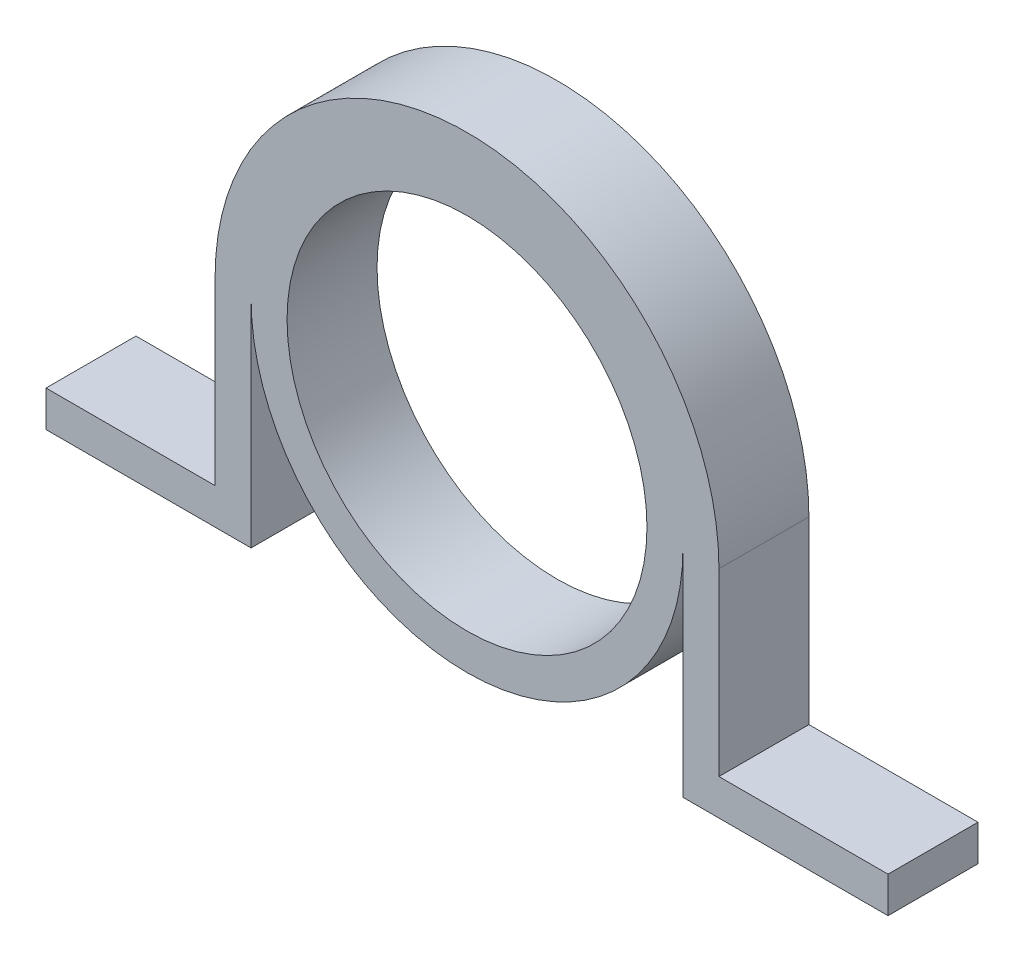
ISO-10303-21;
HEADER;
FILE_DESCRIPTION(('STEP AP214'),'2;1');
FILE_NAME('part.step','',(''),(''),'','','');
FILE_SCHEMA(('AUTOMOTIVE_DESIGN { 1 0 10303 214 1 1 1 1 }'));
ENDSEC;
DATA;
#1=APPLICATION_CONTEXT('core data for automotive mechanical design processes');
#2=APPLICATION_PROTOCOL_DEFINITION('international standard','automotive_design',2000,#1);
#3=PRODUCT_CONTEXT('',#1,'mechanical');
#4=PRODUCT('Part','Part','',(#3));
#5=PRODUCT_RELATED_PRODUCT_CATEGORY('part','',(#4));
#6=PRODUCT_DEFINITION_FORMATION('','',#4);
#7=PRODUCT_DEFINITION_CONTEXT('part definition',#1,'design');
#8=PRODUCT_DEFINITION('design','',#6,#7);
#9=PRODUCT_DEFINITION_SHAPE('','',#8);
#10=(LENGTH_UNIT() NAMED_UNIT(*) SI_UNIT(.MILLI.,.METRE.));
#11=(NAMED_UNIT(*) PLANE_ANGLE_UNIT() SI_UNIT($,.RADIAN.));
#12=(NAMED_UNIT(*) SI_UNIT($,.STERADIAN.) SOLID_ANGLE_UNIT());
#13=UNCERTAINTY_MEASURE_WITH_UNIT(LENGTH_MEASURE(1.E-05),#10,'distance_accuracy_value','');
#14=(GEOMETRIC_REPRESENTATION_CONTEXT(3) GLOBAL_UNCERTAINTY_ASSIGNED_CONTEXT((#13)) GLOBAL_UNIT_ASSIGNED_CONTEXT((#10,
#11,#12)) REPRESENTATION_CONTEXT('',''));
#15=CARTESIAN_POINT('',(0.,0.,0.));
#16=DIRECTION('',(0.,0.,1.));
#17=DIRECTION('',(1.,0.,0.));
#18=AXIS2_PLACEMENT_3D('',#15,#16,#17);
#19=CARTESIAN_POINT('',(14.,0.,5.));
#20=DIRECTION('',(-1.,0.,0.));
#21=DIRECTION('',(0.,0.,1.));
#22=AXIS2_PLACEMENT_3D('',#19,#20,#21);
#23=PLANE('',#22);
#24=DIRECTION('',(0.,1.,0.));
#25=VECTOR('',#24,1.);
#26=CARTESIAN_POINT('',(14.,0.,0.));
#27=LINE('',#26,#25);
#28=CARTESIAN_POINT('',(14.,-10.,0.));
#29=VERTEX_POINT('',#28);
#30=CARTESIAN_POINT('',(14.,0.,0.));
#31=VERTEX_POINT('',#30);
#32=EDGE_CURVE('E171',#29,#31,#27,.T.);
#33=ORIENTED_EDGE('',*,*,#32,.T.);
#34=DIRECTION('',(0.,0.,-1.));
#35=VECTOR('',#34,1.);
#36=CARTESIAN_POINT('',(14.,0.,5.));
#37=LINE('',#36,#35);
#38=CARTESIAN_POINT('',(14.,0.,5.));
#39=VERTEX_POINT('',#38);
#40=EDGE_CURVE('E11',#39,#31,#37,.T.);
#41=ORIENTED_EDGE('',*,*,#40,.F.);
#42=DIRECTION('',(0.,1.,0.));
#43=VECTOR('',#42,1.);
#44=CARTESIAN_POINT('',(14.,0.,5.));
#45=LINE('',#44,#43);
#46=CARTESIAN_POINT('',(14.,-10.,5.));
#47=VERTEX_POINT('',#46);
#48=EDGE_CURVE('E215',#47,#39,#45,.T.);
#49=ORIENTED_EDGE('',*,*,#48,.F.);
#50=DIRECTION('',(0.,0.,-1.));
#51=VECTOR('',#50,1.);
#52=CARTESIAN_POINT('',(14.,-10.,5.));
#53=LINE('',#52,#51);
#54=EDGE_CURVE('E170',#47,#29,#53,.T.);
#55=ORIENTED_EDGE('',*,*,#54,.T.);
#56=EDGE_LOOP('',(#33,#41,#49,#55));
#57=FACE_BOUND('',#56,.T.);
#58=ADVANCED_FACE('F41',(#57),#23,.F.);
#59=CARTESIAN_POINT('',(0.,0.,5.));
#60=DIRECTION('',(0.,0.,-1.));
#61=DIRECTION('',(-1.,0.,0.));
#62=AXIS2_PLACEMENT_3D('',#59,#60,#61);
#63=CYLINDRICAL_SURFACE('',#62,14.);
#64=CARTESIAN_POINT('',(0.,0.,0.));
#65=DIRECTION('',(0.,0.,1.));
#66=DIRECTION('',(1.,0.,0.));
#67=AXIS2_PLACEMENT_3D('',#64,#65,#66);
#68=CIRCLE('',#67,14.);
#69=CARTESIAN_POINT('',(-14.,0.,0.));
#70=VERTEX_POINT('',#69);
#71=EDGE_CURVE('E175',#31,#70,#68,.T.);
#72=ORIENTED_EDGE('',*,*,#71,.T.);
#73=DIRECTION('',(0.,0.,-1.));
#74=VECTOR('',#73,1.);
#75=CARTESIAN_POINT('',(-14.,0.,5.));
#76=LINE('',#75,#74);
#77=CARTESIAN_POINT('',(-14.,0.,5.));
#78=VERTEX_POINT('',#77);
#79=EDGE_CURVE('E50',#78,#70,#76,.T.);
#80=ORIENTED_EDGE('',*,*,#79,.F.);
#81=CARTESIAN_POINT('',(0.,0.,5.));
#82=DIRECTION('',(0.,0.,1.));
#83=DIRECTION('',(1.,0.,0.));
#84=AXIS2_PLACEMENT_3D('',#81,#82,#83);
#85=CIRCLE('',#84,14.);
#86=EDGE_CURVE('E113',#39,#78,#85,.T.);
#87=ORIENTED_EDGE('',*,*,#86,.F.);
#88=ORIENTED_EDGE('',*,*,#40,.T.);
#89=EDGE_LOOP('',(#72,#80,#87,#88));
#90=FACE_BOUND('',#89,.T.);
#91=ADVANCED_FACE('F247',(#90),#63,.T.);
#92=CARTESIAN_POINT('',(-14.,0.,5.));
#93=DIRECTION('',(-1.,0.,0.));
#94=DIRECTION('',(0.,0.,1.));
#95=AXIS2_PLACEMENT_3D('',#92,#93,#94);
#96=PLANE('',#95);
#97=DIRECTION('',(0.,1.,0.));
#98=VECTOR('',#97,1.);
#99=CARTESIAN_POINT('',(-14.,0.,0.));
#100=LINE('',#99,#98);
#101=CARTESIAN_POINT('',(-14.,-10.,0.));
#102=VERTEX_POINT('',#101);
#103=EDGE_CURVE('E179',#102,#70,#100,.T.);
#104=ORIENTED_EDGE('',*,*,#103,.F.);
#105=DIRECTION('',(0.,0.,-1.));
#106=VECTOR('',#105,1.);
#107=CARTESIAN_POINT('',(-14.,-10.,5.));
#108=LINE('',#107,#106);
#109=CARTESIAN_POINT('',(-14.,-10.,5.));
#110=VERTEX_POINT('',#109);
#111=EDGE_CURVE('E238',#110,#102,#108,.T.);
#112=ORIENTED_EDGE('',*,*,#111,.F.);
#113=DIRECTION('',(0.,1.,0.));
#114=VECTOR('',#113,1.);
#115=CARTESIAN_POINT('',(-14.,0.,5.));
#116=LINE('',#115,#114);
#117=EDGE_CURVE('E246',#110,#78,#116,.T.);
#118=ORIENTED_EDGE('',*,*,#117,.T.);
#119=ORIENTED_EDGE('',*,*,#79,.T.);
#120=EDGE_LOOP('',(#104,#112,#118,#119));
#121=FACE_BOUND('',#120,.T.);
#122=ADVANCED_FACE('F244',(#121),#96,.T.);
#123=CARTESIAN_POINT('',(0.,-10.,5.));
#124=DIRECTION('',(0.,1.,0.));
#125=DIRECTION('',(0.,0.,1.));
#126=AXIS2_PLACEMENT_3D('',#123,#124,#125);
#127=PLANE('',#126);
#128=DIRECTION('',(1.,0.,0.));
#129=VECTOR('',#128,1.);
#130=CARTESIAN_POINT('',(0.,-10.,0.));
#131=LINE('',#130,#129);
#132=CARTESIAN_POINT('',(-23.3952710011422,-10.,0.));
#133=VERTEX_POINT('',#132);
#134=EDGE_CURVE('E183',#133,#102,#131,.T.);
#135=ORIENTED_EDGE('',*,*,#134,.F.);
#136=DIRECTION('',(0.,0.,-1.));
#137=VECTOR('',#136,1.);
#138=CARTESIAN_POINT('',(-23.3952710011422,-10.,5.));
#139=LINE('',#138,#137);
#140=CARTESIAN_POINT('',(-23.3952710011422,-10.,5.));
#141=VERTEX_POINT('',#140);
#142=EDGE_CURVE('E235',#141,#133,#139,.T.);
#143=ORIENTED_EDGE('',*,*,#142,.F.);
#144=DIRECTION('',(1.,0.,0.));
#145=VECTOR('',#144,1.);
#146=CARTESIAN_POINT('',(0.,-10.,5.));
#147=LINE('',#146,#145);
#148=EDGE_CURVE('E259',#141,#110,#147,.T.);
#149=ORIENTED_EDGE('',*,*,#148,.T.);
#150=ORIENTED_EDGE('',*,*,#111,.T.);
#151=EDGE_LOOP('',(#135,#143,#149,#150));
#152=FACE_BOUND('',#151,.T.);
#153=ADVANCED_FACE('F256',(#152),#127,.T.);
#154=CARTESIAN_POINT('',(-23.3952710011422,0.,5.));
#155=DIRECTION('',(-1.,0.,0.));
#156=DIRECTION('',(0.,0.,1.));
#157=AXIS2_PLACEMENT_3D('',#154,#155,#156);
#158=PLANE('',#157);
#159=DIRECTION('',(0.,1.,0.));
#160=VECTOR('',#159,1.);
#161=CARTESIAN_POINT('',(-23.3952710011422,0.,0.));
#162=LINE('',#161,#160);
#163=CARTESIAN_POINT('',(-23.3952710011422,-12.,0.));
#164=VERTEX_POINT('',#163);
#165=EDGE_CURVE('E187',#164,#133,#162,.T.);
#166=ORIENTED_EDGE('',*,*,#165,.F.);
#167=DIRECTION('',(0.,0.,-1.));
#168=VECTOR('',#167,1.);
#169=CARTESIAN_POINT('',(-23.3952710011422,-12.,5.));
#170=LINE('',#169,#168);
#171=CARTESIAN_POINT('',(-23.3952710011422,-12.,5.));
#172=VERTEX_POINT('',#171);
#173=EDGE_CURVE('E232',#172,#164,#170,.T.);
#174=ORIENTED_EDGE('',*,*,#173,.F.);
#175=DIRECTION('',(0.,1.,0.));
#176=VECTOR('',#175,1.);
#177=CARTESIAN_POINT('',(-23.3952710011422,0.,5.));
#178=LINE('',#177,#176);
#179=EDGE_CURVE('E266',#172,#141,#178,.T.);
#180=ORIENTED_EDGE('',*,*,#179,.T.);
#181=ORIENTED_EDGE('',*,*,#142,.T.);
#182=EDGE_LOOP('',(#166,#174,#180,#181));
#183=FACE_BOUND('',#182,.T.);
#184=ADVANCED_FACE('F318',(#183),#158,.T.);
#185=CARTESIAN_POINT('',(0.,-12.,5.));
#186=DIRECTION('',(0.,-1.,0.));
#187=DIRECTION('',(0.,0.,-1.));
#188=AXIS2_PLACEMENT_3D('',#185,#186,#187);
#189=PLANE('',#188);
#190=DIRECTION('',(-1.,0.,0.));
#191=VECTOR('',#190,1.);
#192=CARTESIAN_POINT('',(0.,-12.,0.));
#193=LINE('',#192,#191);
#194=CARTESIAN_POINT('',(-12.,-12.,0.));
#195=VERTEX_POINT('',#194);
#196=EDGE_CURVE('E191',#195,#164,#193,.T.);
#197=ORIENTED_EDGE('',*,*,#196,.F.);
#198=DIRECTION('',(0.,0.,-1.));
#199=VECTOR('',#198,1.);
#200=CARTESIAN_POINT('',(-12.,-12.,5.));
#201=LINE('',#200,#199);
#202=CARTESIAN_POINT('',(-12.,-12.,5.));
#203=VERTEX_POINT('',#202);
#204=EDGE_CURVE('E229',#203,#195,#201,.T.);
#205=ORIENTED_EDGE('',*,*,#204,.F.);
#206=DIRECTION('',(-1.,0.,0.));
#207=VECTOR('',#206,1.);
#208=CARTESIAN_POINT('',(0.,-12.,5.));
#209=LINE('',#208,#207);
#210=EDGE_CURVE('E273',#203,#172,#209,.T.);
#211=ORIENTED_EDGE('',*,*,#210,.T.);
#212=ORIENTED_EDGE('',*,*,#173,.T.);
#213=EDGE_LOOP('',(#197,#205,#211,#212));
#214=FACE_BOUND('',#213,.T.);
#215=ADVANCED_FACE('F321',(#214),#189,.T.);
#216=CARTESIAN_POINT('',(-12.,0.,5.));
#217=DIRECTION('',(1.,0.,0.));
#218=DIRECTION('',(0.,0.,-1.));
#219=AXIS2_PLACEMENT_3D('',#216,#217,#218);
#220=PLANE('',#219);
#221=DIRECTION('',(0.,-1.,0.));
#222=VECTOR('',#221,1.);
#223=CARTESIAN_POINT('',(-12.,0.,0.));
#224=LINE('',#223,#222);
#225=CARTESIAN_POINT('',(-12.,0.,0.));
#226=VERTEX_POINT('',#225);
#227=EDGE_CURVE('E195',#226,#195,#224,.T.);
#228=ORIENTED_EDGE('',*,*,#227,.F.);
#229=DIRECTION('',(0.,0.,-1.));
#230=VECTOR('',#229,1.);
#231=CARTESIAN_POINT('',(-12.,0.,5.));
#232=LINE('',#231,#230);
#233=CARTESIAN_POINT('',(-12.,0.,5.));
#234=VERTEX_POINT('',#233);
#235=EDGE_CURVE('E226',#234,#226,#232,.T.);
#236=ORIENTED_EDGE('',*,*,#235,.F.);
#237=DIRECTION('',(0.,-1.,0.));
#238=VECTOR('',#237,1.);
#239=CARTESIAN_POINT('',(-12.,0.,5.));
#240=LINE('',#239,#238);
#241=EDGE_CURVE('E277',#234,#203,#240,.T.);
#242=ORIENTED_EDGE('',*,*,#241,.T.);
#243=ORIENTED_EDGE('',*,*,#204,.T.);
#244=EDGE_LOOP('',(#228,#236,#242,#243));
#245=FACE_BOUND('',#244,.T.);
#246=ADVANCED_FACE('F325',(#245),#220,.T.);
#247=CARTESIAN_POINT('',(0.,0.,5.));
#248=DIRECTION('',(0.,0.,-1.));
#249=DIRECTION('',(-1.,0.,0.));
#250=AXIS2_PLACEMENT_3D('',#247,#248,#249);
#251=CYLINDRICAL_SURFACE('',#250,12.);
#252=CARTESIAN_POINT('',(0.,0.,0.));
#253=DIRECTION('',(0.,0.,1.));
#254=DIRECTION('',(1.,0.,0.));
#255=AXIS2_PLACEMENT_3D('',#252,#253,#254);
#256=CIRCLE('',#255,12.);
#257=CARTESIAN_POINT('',(12.,0.,0.));
#258=VERTEX_POINT('',#257);
#259=EDGE_CURVE('E199',#226,#258,#256,.T.);
#260=ORIENTED_EDGE('',*,*,#259,.T.);
#261=DIRECTION('',(0.,0.,-1.));
#262=VECTOR('',#261,1.);
#263=CARTESIAN_POINT('',(12.,0.,5.));
#264=LINE('',#263,#262);
#265=CARTESIAN_POINT('',(12.,0.,5.));
#266=VERTEX_POINT('',#265);
#267=EDGE_CURVE('E222',#266,#258,#264,.T.);
#268=ORIENTED_EDGE('',*,*,#267,.F.);
#269=CARTESIAN_POINT('',(0.,0.,5.));
#270=DIRECTION('',(0.,0.,1.));
#271=DIRECTION('',(1.,0.,0.));
#272=AXIS2_PLACEMENT_3D('',#269,#270,#271);
#273=CIRCLE('',#272,12.);
#274=EDGE_CURVE('E281',#234,#266,#273,.T.);
#275=ORIENTED_EDGE('',*,*,#274,.F.);
#276=ORIENTED_EDGE('',*,*,#235,.T.);
#277=EDGE_LOOP('',(#260,#268,#275,#276));
#278=FACE_BOUND('',#277,.T.);
#279=ADVANCED_FACE('F289',(#278),#251,.T.);
#280=CARTESIAN_POINT('',(12.,0.,5.));
#281=DIRECTION('',(1.,0.,0.));
#282=DIRECTION('',(0.,0.,-1.));
#283=AXIS2_PLACEMENT_3D('',#280,#281,#282);
#284=PLANE('',#283);
#285=DIRECTION('',(0.,-1.,0.));
#286=VECTOR('',#285,1.);
#287=CARTESIAN_POINT('',(12.,0.,0.));
#288=LINE('',#287,#286);
#289=CARTESIAN_POINT('',(12.,-12.,0.));
#290=VERTEX_POINT('',#289);
#291=EDGE_CURVE('E202',#258,#290,#288,.T.);
#292=ORIENTED_EDGE('',*,*,#291,.T.);
#293=DIRECTION('',(0.,0.,-1.));
#294=VECTOR('',#293,1.);
#295=CARTESIAN_POINT('',(12.,-12.,5.));
#296=LINE('',#295,#294);
#297=CARTESIAN_POINT('',(12.,-12.,5.));
#298=VERTEX_POINT('',#297);
#299=EDGE_CURVE('E156',#298,#290,#296,.T.);
#300=ORIENTED_EDGE('',*,*,#299,.F.);
#301=DIRECTION('',(0.,-1.,0.));
#302=VECTOR('',#301,1.);
#303=CARTESIAN_POINT('',(12.,0.,5.));
#304=LINE('',#303,#302);
#305=EDGE_CURVE('E145',#266,#298,#304,.T.);
#306=ORIENTED_EDGE('',*,*,#305,.F.);
#307=ORIENTED_EDGE('',*,*,#267,.T.);
#308=EDGE_LOOP('',(#292,#300,#306,#307));
#309=FACE_BOUND('',#308,.T.);
#310=ADVANCED_FACE('F293',(#309),#284,.F.);
#311=CARTESIAN_POINT('',(0.,-12.,5.));
#312=DIRECTION('',(0.,1.,0.));
#313=DIRECTION('',(0.,0.,1.));
#314=AXIS2_PLACEMENT_3D('',#311,#312,#313);
#315=PLANE('',#314);
#316=DIRECTION('',(1.,0.,0.));
#317=VECTOR('',#316,1.);
#318=CARTESIAN_POINT('',(0.,-12.,0.));
#319=LINE('',#318,#317);
#320=CARTESIAN_POINT('',(23.3952710011422,-12.,0.));
#321=VERTEX_POINT('',#320);
#322=EDGE_CURVE('E154',#290,#321,#319,.T.);
#323=ORIENTED_EDGE('',*,*,#322,.T.);
#324=DIRECTION('',(0.,0.,-1.));
#325=VECTOR('',#324,1.);
#326=CARTESIAN_POINT('',(23.3952710011422,-12.,5.));
#327=LINE('',#326,#325);
#328=CARTESIAN_POINT('',(23.3952710011422,-12.,5.));
#329=VERTEX_POINT('',#328);
#330=EDGE_CURVE('E151',#329,#321,#327,.T.);
#331=ORIENTED_EDGE('',*,*,#330,.F.);
#332=DIRECTION('',(1.,0.,0.));
#333=VECTOR('',#332,1.);
#334=CARTESIAN_POINT('',(0.,-12.,5.));
#335=LINE('',#334,#333);
#336=EDGE_CURVE('E138',#298,#329,#335,.T.);
#337=ORIENTED_EDGE('',*,*,#336,.F.);
#338=ORIENTED_EDGE('',*,*,#299,.T.);
#339=EDGE_LOOP('',(#323,#331,#337,#338));
#340=FACE_BOUND('',#339,.T.);
#341=ADVANCED_FACE('F152',(#340),#315,.F.);
#342=CARTESIAN_POINT('',(23.3952710011422,0.,5.));
#343=DIRECTION('',(-1.,0.,0.));
#344=DIRECTION('',(0.,0.,1.));
#345=AXIS2_PLACEMENT_3D('',#342,#343,#344);
#346=PLANE('',#345);
#347=DIRECTION('',(0.,1.,0.));
#348=VECTOR('',#347,1.);
#349=CARTESIAN_POINT('',(23.3952710011422,0.,0.));
#350=LINE('',#349,#348);
#351=CARTESIAN_POINT('',(23.3952710011422,-10.,0.));
#352=VERTEX_POINT('',#351);
#353=EDGE_CURVE('E99',#321,#352,#350,.T.);
#354=ORIENTED_EDGE('',*,*,#353,.T.);
#355=DIRECTION('',(0.,0.,-1.));
#356=VECTOR('',#355,1.);
#357=CARTESIAN_POINT('',(23.3952710011422,-10.,5.));
#358=LINE('',#357,#356);
#359=CARTESIAN_POINT('',(23.3952710011422,-10.,5.));
#360=VERTEX_POINT('',#359);
#361=EDGE_CURVE('E157',#360,#352,#358,.T.);
#362=ORIENTED_EDGE('',*,*,#361,.F.);
#363=DIRECTION('',(0.,1.,0.));
#364=VECTOR('',#363,1.);
#365=CARTESIAN_POINT('',(23.3952710011422,0.,5.));
#366=LINE('',#365,#364);
#367=EDGE_CURVE('E143',#329,#360,#366,.T.);
#368=ORIENTED_EDGE('',*,*,#367,.F.);
#369=ORIENTED_EDGE('',*,*,#330,.T.);
#370=EDGE_LOOP('',(#354,#362,#368,#369));
#371=FACE_BOUND('',#370,.T.);
#372=ADVANCED_FACE('F159',(#371),#346,.F.);
#373=CARTESIAN_POINT('',(0.,-10.,5.));
#374=DIRECTION('',(0.,-1.,0.));
#375=DIRECTION('',(0.,0.,-1.));
#376=AXIS2_PLACEMENT_3D('',#373,#374,#375);
#377=PLANE('',#376);
#378=DIRECTION('',(-1.,0.,0.));
#379=VECTOR('',#378,1.);
#380=CARTESIAN_POINT('',(0.,-10.,0.));
#381=LINE('',#380,#379);
#382=EDGE_CURVE('E105',#352,#29,#381,.T.);
#383=ORIENTED_EDGE('',*,*,#382,.T.);
#384=ORIENTED_EDGE('',*,*,#54,.F.);
#385=DIRECTION('',(-1.,0.,0.));
#386=VECTOR('',#385,1.);
#387=CARTESIAN_POINT('',(0.,-10.,5.));
#388=LINE('',#387,#386);
#389=EDGE_CURVE('E58',#360,#47,#388,.T.);
#390=ORIENTED_EDGE('',*,*,#389,.F.);
#391=ORIENTED_EDGE('',*,*,#361,.T.);
#392=EDGE_LOOP('',(#383,#384,#390,#391));
#393=FACE_BOUND('',#392,.T.);
#394=ADVANCED_FACE('F296',(#393),#377,.F.);
#395=CARTESIAN_POINT('',(0.,0.,5.));
#396=DIRECTION('',(0.,0.,-1.));
#397=DIRECTION('',(-1.,0.,0.));
#398=AXIS2_PLACEMENT_3D('',#395,#396,#397);
#399=CYLINDRICAL_SURFACE('',#398,10.);
#400=CARTESIAN_POINT('',(0.,0.,5.));
#401=DIRECTION('',(0.,0.,1.));
#402=DIRECTION('',(1.,0.,0.));
#403=AXIS2_PLACEMENT_3D('',#400,#401,#402);
#404=CIRCLE('',#403,10.);
#405=CARTESIAN_POINT('',(10.,0.,5.));
#406=VERTEX_POINT('',#405);
#407=EDGE_CURVE('E163',#406,#406,#404,.T.);
#408=ORIENTED_EDGE('',*,*,#407,.T.);
#409=EDGE_LOOP('',(#408));
#410=FACE_BOUND('',#409,.T.);
#411=CARTESIAN_POINT('',(0.,0.,0.));
#412=DIRECTION('',(0.,0.,1.));
#413=DIRECTION('',(1.,0.,0.));
#414=AXIS2_PLACEMENT_3D('',#411,#412,#413);
#415=CIRCLE('',#414,10.);
#416=CARTESIAN_POINT('',(10.,0.,0.));
#417=VERTEX_POINT('',#416);
#418=EDGE_CURVE('E211',#417,#417,#415,.T.);
#419=ORIENTED_EDGE('',*,*,#418,.F.);
#420=EDGE_LOOP('',(#419));
#421=FACE_BOUND('',#420,.T.);
#422=ADVANCED_FACE('F298',(#410,#421),#399,.F.);
#423=CARTESIAN_POINT('',(0.,0.,5.));
#424=DIRECTION('',(0.,0.,1.));
#425=DIRECTION('',(1.,0.,0.));
#426=AXIS2_PLACEMENT_3D('',#423,#424,#425);
#427=PLANE('',#426);
#428=ORIENTED_EDGE('',*,*,#48,.T.);
#429=ORIENTED_EDGE('',*,*,#86,.T.);
#430=ORIENTED_EDGE('',*,*,#117,.F.);
#431=ORIENTED_EDGE('',*,*,#148,.F.);
#432=ORIENTED_EDGE('',*,*,#179,.F.);
#433=ORIENTED_EDGE('',*,*,#210,.F.);
#434=ORIENTED_EDGE('',*,*,#241,.F.);
#435=ORIENTED_EDGE('',*,*,#274,.T.);
#436=ORIENTED_EDGE('',*,*,#305,.T.);
#437=ORIENTED_EDGE('',*,*,#336,.T.);
#438=ORIENTED_EDGE('',*,*,#367,.T.);
#439=ORIENTED_EDGE('',*,*,#389,.T.);
#440=EDGE_LOOP('',(#428,#429,#430,#431,#432,#433,#434,#435,#436,#437,#438,#439));
#441=FACE_BOUND('',#440,.T.);
#442=ORIENTED_EDGE('',*,*,#407,.F.);
#443=EDGE_LOOP('',(#442));
#444=FACE_BOUND('',#443,.T.);
#445=ADVANCED_FACE('F140',(#441,#444),#427,.T.);
#446=CARTESIAN_POINT('',(0.,0.,0.));
#447=DIRECTION('',(0.,0.,1.));
#448=DIRECTION('',(1.,0.,0.));
#449=AXIS2_PLACEMENT_3D('',#446,#447,#448);
#450=PLANE('',#449);
#451=ORIENTED_EDGE('',*,*,#32,.F.);
#452=ORIENTED_EDGE('',*,*,#382,.F.);
#453=ORIENTED_EDGE('',*,*,#353,.F.);
#454=ORIENTED_EDGE('',*,*,#322,.F.);
#455=ORIENTED_EDGE('',*,*,#291,.F.);
#456=ORIENTED_EDGE('',*,*,#259,.F.);
#457=ORIENTED_EDGE('',*,*,#227,.T.);
#458=ORIENTED_EDGE('',*,*,#196,.T.);
#459=ORIENTED_EDGE('',*,*,#165,.T.);
#460=ORIENTED_EDGE('',*,*,#134,.T.);
#461=ORIENTED_EDGE('',*,*,#103,.T.);
#462=ORIENTED_EDGE('',*,*,#71,.F.);
#463=EDGE_LOOP('',(#451,#452,#453,#454,#455,#456,#457,#458,#459,#460,#461,#462));
#464=FACE_BOUND('',#463,.T.);
#465=ORIENTED_EDGE('',*,*,#418,.T.);
#466=EDGE_LOOP('',(#465));
#467=FACE_BOUND('',#466,.T.);
#468=ADVANCED_FACE('F251',(#464,#467),#450,.F.);
#469=CLOSED_SHELL('',(#58,#91,#122,#153,#184,#215,#246,#279,#310,#341,#372,#394,#422,#445,#468));
#470=MANIFOLD_SOLID_BREP('B2',#469);
#471=ADVANCED_BREP_SHAPE_REPRESENTATION('',(#18,#470),#14);
#472=SHAPE_DEFINITION_REPRESENTATION(#9,#471);
ENDSEC;
END-ISO-10303-21;
